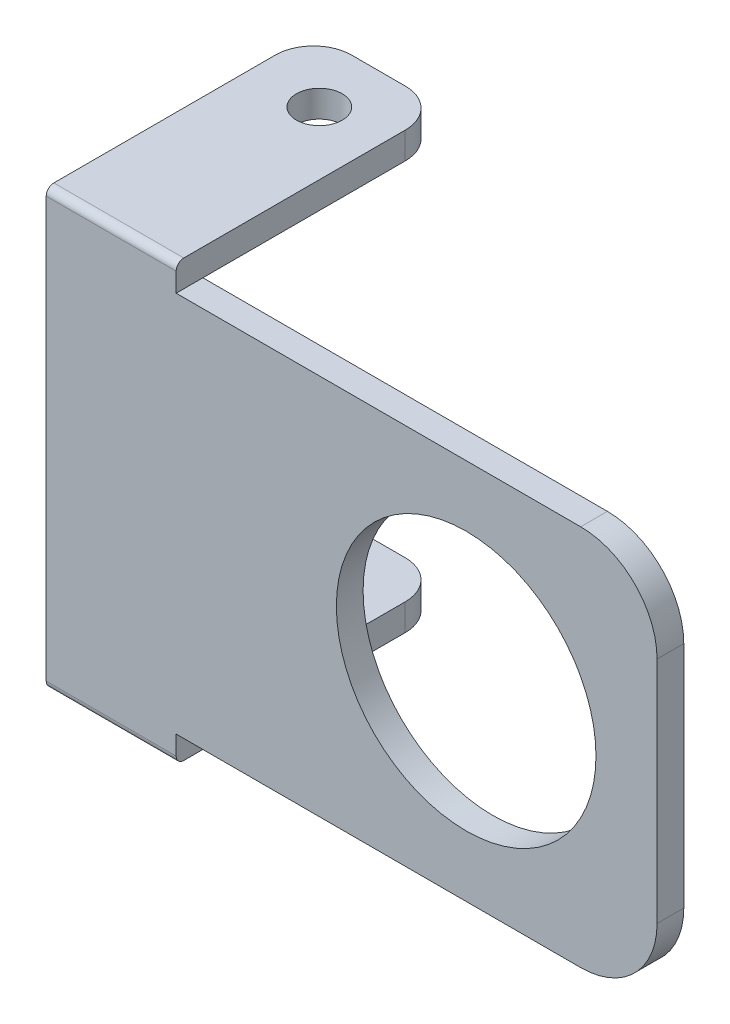
ISO-10303-21;
HEADER;
FILE_DESCRIPTION(('STEP AP214'),'2;1');
FILE_NAME('part.step','',(''),(''),'','','');
FILE_SCHEMA(('AUTOMOTIVE_DESIGN { 1 0 10303 214 1 1 1 1 }'));
ENDSEC;
DATA;
#1=APPLICATION_CONTEXT('core data for automotive mechanical design processes');
#2=APPLICATION_PROTOCOL_DEFINITION('international standard','automotive_design',2000,#1);
#3=PRODUCT_CONTEXT('',#1,'mechanical');
#4=PRODUCT('Part','Part','',(#3));
#5=PRODUCT_RELATED_PRODUCT_CATEGORY('part','',(#4));
#6=PRODUCT_DEFINITION_FORMATION('','',#4);
#7=PRODUCT_DEFINITION_CONTEXT('part definition',#1,'design');
#8=PRODUCT_DEFINITION('design','',#6,#7);
#9=PRODUCT_DEFINITION_SHAPE('','',#8);
#10=(LENGTH_UNIT() NAMED_UNIT(*) SI_UNIT(.MILLI.,.METRE.));
#11=(NAMED_UNIT(*) PLANE_ANGLE_UNIT() SI_UNIT($,.RADIAN.));
#12=(NAMED_UNIT(*) SI_UNIT($,.STERADIAN.) SOLID_ANGLE_UNIT());
#13=UNCERTAINTY_MEASURE_WITH_UNIT(LENGTH_MEASURE(1.E-05),#10,'distance_accuracy_value','');
#14=(GEOMETRIC_REPRESENTATION_CONTEXT(3) GLOBAL_UNCERTAINTY_ASSIGNED_CONTEXT((#13)) GLOBAL_UNIT_ASSIGNED_CONTEXT((#10,
#11,#12)) REPRESENTATION_CONTEXT('',''));
#15=CARTESIAN_POINT('',(0.,0.,0.));
#16=DIRECTION('',(0.,0.,1.));
#17=DIRECTION('',(1.,0.,0.));
#18=AXIS2_PLACEMENT_3D('',#15,#16,#17);
#19=CARTESIAN_POINT('',(-40.,-28.5,-31.5));
#20=DIRECTION('',(0.,1.,0.));
#21=DIRECTION('',(0.,0.,-1.));
#22=AXIS2_PLACEMENT_3D('',#19,#20,#21);
#23=PLANE('',#22);
#24=DIRECTION('',(0.,0.,1.));
#25=VECTOR('',#24,1.);
#26=CARTESIAN_POINT('',(-40.,-28.5,3.5));
#27=LINE('',#26,#25);
#28=CARTESIAN_POINT('',(-40.,-28.5,-26.5));
#29=VERTEX_POINT('',#28);
#30=CARTESIAN_POINT('',(-40.,-28.5,2.5));
#31=VERTEX_POINT('',#30);
#32=EDGE_CURVE('E199',#29,#31,#27,.T.);
#33=ORIENTED_EDGE('',*,*,#32,.F.);
#34=CARTESIAN_POINT('',(-35.,-28.5,-26.5));
#35=DIRECTION('',(0.,1.,0.));
#36=DIRECTION('',(0.,0.,1.));
#37=AXIS2_PLACEMENT_3D('',#34,#35,#36);
#38=CIRCLE('',#37,5.);
#39=CARTESIAN_POINT('',(-35.,-28.5,-31.5));
#40=VERTEX_POINT('',#39);
#41=EDGE_CURVE('E316',#29,#40,#38,.F.);
#42=ORIENTED_EDGE('',*,*,#41,.T.);
#43=DIRECTION('',(-1.,0.,0.));
#44=VECTOR('',#43,1.);
#45=CARTESIAN_POINT('',(-22.9795824028962,-28.5,-31.5));
#46=LINE('',#45,#44);
#47=CARTESIAN_POINT('',(-27.9795824028962,-28.5,-31.5));
#48=VERTEX_POINT('',#47);
#49=EDGE_CURVE('E284',#48,#40,#46,.T.);
#50=ORIENTED_EDGE('',*,*,#49,.F.);
#51=CARTESIAN_POINT('',(-27.9795824028962,-28.5,-26.5));
#52=DIRECTION('',(0.,1.,0.));
#53=DIRECTION('',(0.,0.,1.));
#54=AXIS2_PLACEMENT_3D('',#51,#52,#53);
#55=CIRCLE('',#54,5.);
#56=CARTESIAN_POINT('',(-22.9795824028962,-28.5,-26.5));
#57=VERTEX_POINT('',#56);
#58=EDGE_CURVE('E314',#48,#57,#55,.F.);
#59=ORIENTED_EDGE('',*,*,#58,.T.);
#60=DIRECTION('',(0.,0.,-1.));
#61=VECTOR('',#60,1.);
#62=CARTESIAN_POINT('',(-22.9795824028962,-28.5,3.50000000000001));
#63=LINE('',#62,#61);
#64=CARTESIAN_POINT('',(-22.9795824028962,-28.5,2.5));
#65=VERTEX_POINT('',#64);
#66=EDGE_CURVE('E542',#65,#57,#63,.T.);
#67=ORIENTED_EDGE('',*,*,#66,.F.);
#68=DIRECTION('',(1.,0.,0.));
#69=VECTOR('',#68,1.);
#70=CARTESIAN_POINT('',(-40.,-28.5,2.5));
#71=LINE('',#70,#69);
#72=EDGE_CURVE('E273',#65,#31,#71,.F.);
#73=ORIENTED_EDGE('',*,*,#72,.T.);
#74=EDGE_LOOP('',(#33,#42,#50,#59,#67,#73));
#75=FACE_BOUND('',#74,.T.);
#76=CARTESIAN_POINT('',(-31.2295824028962,-28.5,-23.5));
#77=DIRECTION('',(0.,1.,0.));
#78=DIRECTION('',(0.,0.,1.));
#79=AXIS2_PLACEMENT_3D('',#76,#77,#78);
#80=CIRCLE('',#79,3.);
#81=CARTESIAN_POINT('',(-31.2295824028962,-28.5,-20.5));
#82=VERTEX_POINT('',#81);
#83=EDGE_CURVE('E344',#82,#82,#80,.T.);
#84=ORIENTED_EDGE('',*,*,#83,.T.);
#85=EDGE_LOOP('',(#84));
#86=FACE_BOUND('',#85,.T.);
#87=ADVANCED_FACE('F32',(#75,#86),#23,.F.);
#88=CARTESIAN_POINT('',(-40.,-25.,-31.5));
#89=DIRECTION('',(0.,1.,0.));
#90=DIRECTION('',(0.,0.,-1.));
#91=AXIS2_PLACEMENT_3D('',#88,#89,#90);
#92=PLANE('',#91);
#93=DIRECTION('',(-1.,0.,0.));
#94=VECTOR('',#93,1.);
#95=CARTESIAN_POINT('',(-22.9795824028962,-25.,-31.5));
#96=LINE('',#95,#94);
#97=CARTESIAN_POINT('',(-27.9795824028962,-25.,-31.5));
#98=VERTEX_POINT('',#97);
#99=CARTESIAN_POINT('',(-35.,-25.,-31.5));
#100=VERTEX_POINT('',#99);
#101=EDGE_CURVE('E339',#98,#100,#96,.T.);
#102=ORIENTED_EDGE('',*,*,#101,.T.);
#103=CARTESIAN_POINT('',(-35.,-25.,-26.5));
#104=DIRECTION('',(0.,1.,0.));
#105=DIRECTION('',(0.,0.,1.));
#106=AXIS2_PLACEMENT_3D('',#103,#104,#105);
#107=CIRCLE('',#106,5.);
#108=CARTESIAN_POINT('',(-40.,-25.,-26.5));
#109=VERTEX_POINT('',#108);
#110=EDGE_CURVE('E308',#100,#109,#107,.T.);
#111=ORIENTED_EDGE('',*,*,#110,.T.);
#112=DIRECTION('',(0.,0.,1.));
#113=VECTOR('',#112,1.);
#114=CARTESIAN_POINT('',(-40.,-25.,3.5));
#115=LINE('',#114,#113);
#116=CARTESIAN_POINT('',(-40.,-25.,0.));
#117=VERTEX_POINT('',#116);
#118=EDGE_CURVE('E210',#109,#117,#115,.T.);
#119=ORIENTED_EDGE('',*,*,#118,.T.);
#120=DIRECTION('',(1.,0.,0.));
#121=VECTOR('',#120,1.);
#122=CARTESIAN_POINT('',(-40.,-25.,0.));
#123=LINE('',#122,#121);
#124=CARTESIAN_POINT('',(-22.9795824028962,-25.,0.));
#125=VERTEX_POINT('',#124);
#126=EDGE_CURVE('E250',#117,#125,#123,.T.);
#127=ORIENTED_EDGE('',*,*,#126,.T.);
#128=DIRECTION('',(0.,0.,-1.));
#129=VECTOR('',#128,1.);
#130=CARTESIAN_POINT('',(-22.9795824028962,-25.,3.50000000000001));
#131=LINE('',#130,#129);
#132=CARTESIAN_POINT('',(-22.9795824028962,-25.,-26.5));
#133=VERTEX_POINT('',#132);
#134=EDGE_CURVE('E207',#125,#133,#131,.T.);
#135=ORIENTED_EDGE('',*,*,#134,.T.);
#136=CARTESIAN_POINT('',(-27.9795824028962,-25.,-26.5));
#137=DIRECTION('',(0.,1.,0.));
#138=DIRECTION('',(0.,0.,1.));
#139=AXIS2_PLACEMENT_3D('',#136,#137,#138);
#140=CIRCLE('',#139,5.);
#141=EDGE_CURVE('E281',#133,#98,#140,.T.);
#142=ORIENTED_EDGE('',*,*,#141,.T.);
#143=EDGE_LOOP('',(#102,#111,#119,#127,#135,#142));
#144=FACE_BOUND('',#143,.T.);
#145=CARTESIAN_POINT('',(-31.2295824028962,-25.,-23.5));
#146=DIRECTION('',(0.,1.,0.));
#147=DIRECTION('',(0.,0.,1.));
#148=AXIS2_PLACEMENT_3D('',#145,#146,#147);
#149=CIRCLE('',#148,3.);
#150=CARTESIAN_POINT('',(-31.2295824028962,-25.,-20.5));
#151=VERTEX_POINT('',#150);
#152=EDGE_CURVE('E341',#151,#151,#149,.F.);
#153=ORIENTED_EDGE('',*,*,#152,.T.);
#154=EDGE_LOOP('',(#153));
#155=FACE_BOUND('',#154,.T.);
#156=ADVANCED_FACE('F437',(#144,#155),#92,.T.);
#157=CARTESIAN_POINT('',(-40.,25.,3.5));
#158=DIRECTION('',(0.,-1.,0.));
#159=DIRECTION('',(0.,0.,-1.));
#160=AXIS2_PLACEMENT_3D('',#157,#158,#159);
#161=PLANE('',#160);
#162=DIRECTION('',(-1.,0.,0.));
#163=VECTOR('',#162,1.);
#164=CARTESIAN_POINT('',(-40.,25.,3.5));
#165=LINE('',#164,#163);
#166=CARTESIAN_POINT('',(30.,25.,3.5));
#167=VERTEX_POINT('',#166);
#168=CARTESIAN_POINT('',(-22.9795824028962,25.,3.5));
#169=VERTEX_POINT('',#168);
#170=EDGE_CURVE('E219',#167,#169,#165,.T.);
#171=ORIENTED_EDGE('',*,*,#170,.F.);
#172=DIRECTION('',(0.,0.,-1.));
#173=VECTOR('',#172,1.);
#174=CARTESIAN_POINT('',(30.,25.,3.5));
#175=LINE('',#174,#173);
#176=CARTESIAN_POINT('',(30.,25.,0.));
#177=VERTEX_POINT('',#176);
#178=EDGE_CURVE('E335',#167,#177,#175,.T.);
#179=ORIENTED_EDGE('',*,*,#178,.T.);
#180=DIRECTION('',(-1.,0.,0.));
#181=VECTOR('',#180,1.);
#182=CARTESIAN_POINT('',(-40.,25.,0.));
#183=LINE('',#182,#181);
#184=CARTESIAN_POINT('',(-22.9795824028962,25.,0.));
#185=VERTEX_POINT('',#184);
#186=EDGE_CURVE('E234',#177,#185,#183,.T.);
#187=ORIENTED_EDGE('',*,*,#186,.T.);
#188=DIRECTION('',(0.,0.,-1.));
#189=VECTOR('',#188,1.);
#190=CARTESIAN_POINT('',(-22.9795824028962,25.,3.50000000000001));
#191=LINE('',#190,#189);
#192=EDGE_CURVE('E294',#169,#185,#191,.T.);
#193=ORIENTED_EDGE('',*,*,#192,.F.);
#194=EDGE_LOOP('',(#171,#179,#187,#193));
#195=FACE_BOUND('',#194,.T.);
#196=ADVANCED_FACE('F410',(#195),#161,.F.);
#197=CARTESIAN_POINT('',(40.,25.,3.5));
#198=DIRECTION('',(-1.,0.,0.));
#199=DIRECTION('',(0.,0.,1.));
#200=AXIS2_PLACEMENT_3D('',#197,#198,#199);
#201=PLANE('',#200);
#202=DIRECTION('',(0.,1.,0.));
#203=VECTOR('',#202,1.);
#204=CARTESIAN_POINT('',(40.,25.,0.));
#205=LINE('',#204,#203);
#206=CARTESIAN_POINT('',(40.,-15.,0.));
#207=VERTEX_POINT('',#206);
#208=CARTESIAN_POINT('',(40.,15.,0.));
#209=VERTEX_POINT('',#208);
#210=EDGE_CURVE('E230',#207,#209,#205,.T.);
#211=ORIENTED_EDGE('',*,*,#210,.T.);
#212=DIRECTION('',(0.,0.,-1.));
#213=VECTOR('',#212,1.);
#214=CARTESIAN_POINT('',(40.,15.,3.5));
#215=LINE('',#214,#213);
#216=CARTESIAN_POINT('',(40.,15.,3.5));
#217=VERTEX_POINT('',#216);
#218=EDGE_CURVE('E53',#209,#217,#215,.F.);
#219=ORIENTED_EDGE('',*,*,#218,.T.);
#220=DIRECTION('',(0.,1.,0.));
#221=VECTOR('',#220,1.);
#222=CARTESIAN_POINT('',(40.,25.,3.5));
#223=LINE('',#222,#221);
#224=CARTESIAN_POINT('',(40.,-15.,3.5));
#225=VERTEX_POINT('',#224);
#226=EDGE_CURVE('E251',#225,#217,#223,.T.);
#227=ORIENTED_EDGE('',*,*,#226,.F.);
#228=DIRECTION('',(0.,0.,-1.));
#229=VECTOR('',#228,1.);
#230=CARTESIAN_POINT('',(40.,-15.,3.5));
#231=LINE('',#230,#229);
#232=EDGE_CURVE('E416',#225,#207,#231,.T.);
#233=ORIENTED_EDGE('',*,*,#232,.T.);
#234=EDGE_LOOP('',(#211,#219,#227,#233));
#235=FACE_BOUND('',#234,.T.);
#236=ADVANCED_FACE('F491',(#235),#201,.F.);
#237=CARTESIAN_POINT('',(-40.,25.,3.5));
#238=DIRECTION('',(1.,0.,0.));
#239=DIRECTION('',(0.,0.,-1.));
#240=AXIS2_PLACEMENT_3D('',#237,#238,#239);
#241=PLANE('',#240);
#242=ORIENTED_EDGE('',*,*,#118,.F.);
#243=DIRECTION('',(0.,1.,0.));
#244=VECTOR('',#243,1.);
#245=CARTESIAN_POINT('',(-40.,-28.5,-26.5));
#246=LINE('',#245,#244);
#247=EDGE_CURVE('E312',#109,#29,#246,.F.);
#248=ORIENTED_EDGE('',*,*,#247,.T.);
#249=ORIENTED_EDGE('',*,*,#32,.T.);
#250=CARTESIAN_POINT('',(-40.,-27.5,2.5));
#251=DIRECTION('',(1.,0.,0.));
#252=DIRECTION('',(0.,0.,-1.));
#253=AXIS2_PLACEMENT_3D('',#250,#251,#252);
#254=CIRCLE('',#253,1.);
#255=CARTESIAN_POINT('',(-40.,-27.5,3.5));
#256=VERTEX_POINT('',#255);
#257=EDGE_CURVE('E266',#31,#256,#254,.F.);
#258=ORIENTED_EDGE('',*,*,#257,.T.);
#259=DIRECTION('',(0.,-1.,0.));
#260=VECTOR('',#259,1.);
#261=CARTESIAN_POINT('',(-40.,25.,3.5));
#262=LINE('',#261,#260);
#263=CARTESIAN_POINT('',(-40.,27.5,3.5));
#264=VERTEX_POINT('',#263);
#265=EDGE_CURVE('E214',#264,#256,#262,.T.);
#266=ORIENTED_EDGE('',*,*,#265,.F.);
#267=CARTESIAN_POINT('',(-40.,27.5,2.5));
#268=DIRECTION('',(1.,0.,0.));
#269=DIRECTION('',(0.,0.,-1.));
#270=AXIS2_PLACEMENT_3D('',#267,#268,#269);
#271=CIRCLE('',#270,1.);
#272=CARTESIAN_POINT('',(-40.,28.5,2.5));
#273=VERTEX_POINT('',#272);
#274=EDGE_CURVE('E268',#264,#273,#271,.F.);
#275=ORIENTED_EDGE('',*,*,#274,.T.);
#276=DIRECTION('',(0.,0.,1.));
#277=VECTOR('',#276,1.);
#278=CARTESIAN_POINT('',(-40.,28.5,3.5));
#279=LINE('',#278,#277);
#280=CARTESIAN_POINT('',(-40.,28.5,-26.5));
#281=VERTEX_POINT('',#280);
#282=EDGE_CURVE('E293',#281,#273,#279,.T.);
#283=ORIENTED_EDGE('',*,*,#282,.F.);
#284=DIRECTION('',(0.,-1.,0.));
#285=VECTOR('',#284,1.);
#286=CARTESIAN_POINT('',(-40.,25.,-26.5));
#287=LINE('',#286,#285);
#288=CARTESIAN_POINT('',(-40.,25.,-26.5));
#289=VERTEX_POINT('',#288);
#290=EDGE_CURVE('E309',#281,#289,#287,.T.);
#291=ORIENTED_EDGE('',*,*,#290,.T.);
#292=DIRECTION('',(0.,0.,1.));
#293=VECTOR('',#292,1.);
#294=CARTESIAN_POINT('',(-40.,25.,3.5));
#295=LINE('',#294,#293);
#296=CARTESIAN_POINT('',(-40.,25.,0.));
#297=VERTEX_POINT('',#296);
#298=EDGE_CURVE('E300',#289,#297,#295,.T.);
#299=ORIENTED_EDGE('',*,*,#298,.T.);
#300=DIRECTION('',(0.,-1.,0.));
#301=VECTOR('',#300,1.);
#302=CARTESIAN_POINT('',(-40.,25.,0.));
#303=LINE('',#302,#301);
#304=EDGE_CURVE('E237',#297,#117,#303,.T.);
#305=ORIENTED_EDGE('',*,*,#304,.T.);
#306=EDGE_LOOP('',(#242,#248,#249,#258,#266,#275,#283,#291,#299,#305));
#307=FACE_BOUND('',#306,.T.);
#308=ADVANCED_FACE('F488',(#307),#241,.F.);
#309=CARTESIAN_POINT('',(-40.,-25.,3.5));
#310=DIRECTION('',(0.,1.,0.));
#311=DIRECTION('',(0.,0.,1.));
#312=AXIS2_PLACEMENT_3D('',#309,#310,#311);
#313=PLANE('',#312);
#314=CARTESIAN_POINT('',(30.,-25.,0.));
#315=VERTEX_POINT('',#314);
#316=EDGE_CURVE('E238',#125,#315,#123,.T.);
#317=ORIENTED_EDGE('',*,*,#316,.T.);
#318=DIRECTION('',(0.,0.,-1.));
#319=VECTOR('',#318,1.);
#320=CARTESIAN_POINT('',(30.,-25.,3.5));
#321=LINE('',#320,#319);
#322=CARTESIAN_POINT('',(30.,-25.,3.5));
#323=VERTEX_POINT('',#322);
#324=EDGE_CURVE('E11',#315,#323,#321,.F.);
#325=ORIENTED_EDGE('',*,*,#324,.T.);
#326=DIRECTION('',(1.,0.,0.));
#327=VECTOR('',#326,1.);
#328=CARTESIAN_POINT('',(-40.,-25.,3.5));
#329=LINE('',#328,#327);
#330=CARTESIAN_POINT('',(-22.9795824028962,-25.,3.50000000000001));
#331=VERTEX_POINT('',#330);
#332=EDGE_CURVE('E192',#331,#323,#329,.T.);
#333=ORIENTED_EDGE('',*,*,#332,.F.);
#334=EDGE_CURVE('E202',#331,#125,#131,.T.);
#335=ORIENTED_EDGE('',*,*,#334,.T.);
#336=EDGE_LOOP('',(#317,#325,#333,#335));
#337=FACE_BOUND('',#336,.T.);
#338=ADVANCED_FACE('F212',(#337),#313,.F.);
#339=CARTESIAN_POINT('',(40.,-25.,3.5));
#340=DIRECTION('',(0.,0.,1.));
#341=DIRECTION('',(1.,0.,0.));
#342=AXIS2_PLACEMENT_3D('',#339,#340,#341);
#343=PLANE('',#342);
#344=CARTESIAN_POINT('',(15.,0.,3.5));
#345=DIRECTION('',(0.,0.,1.));
#346=DIRECTION('',(1.,0.,0.));
#347=AXIS2_PLACEMENT_3D('',#344,#345,#346);
#348=CIRCLE('',#347,17.);
#349=CARTESIAN_POINT('',(32.,0.,3.5));
#350=VERTEX_POINT('',#349);
#351=EDGE_CURVE('E564',#350,#350,#348,.T.);
#352=ORIENTED_EDGE('',*,*,#351,.F.);
#353=EDGE_LOOP('',(#352));
#354=FACE_BOUND('',#353,.T.);
#355=ORIENTED_EDGE('',*,*,#226,.T.);
#356=CARTESIAN_POINT('',(30.,15.,3.5));
#357=DIRECTION('',(0.,0.,1.));
#358=DIRECTION('',(1.,0.,0.));
#359=AXIS2_PLACEMENT_3D('',#356,#357,#358);
#360=CIRCLE('',#359,10.);
#361=EDGE_CURVE('E40',#217,#167,#360,.T.);
#362=ORIENTED_EDGE('',*,*,#361,.T.);
#363=ORIENTED_EDGE('',*,*,#170,.T.);
#364=DIRECTION('',(0.,-1.,0.));
#365=VECTOR('',#364,1.);
#366=CARTESIAN_POINT('',(-22.9795824028962,28.5,3.50000000000001));
#367=LINE('',#366,#365);
#368=CARTESIAN_POINT('',(-22.9795824028962,27.5,3.50000000000001));
#369=VERTEX_POINT('',#368);
#370=EDGE_CURVE('E257',#369,#169,#367,.T.);
#371=ORIENTED_EDGE('',*,*,#370,.F.);
#372=DIRECTION('',(1.,0.,0.));
#373=VECTOR('',#372,1.);
#374=CARTESIAN_POINT('',(-40.,27.5,3.5));
#375=LINE('',#374,#373);
#376=EDGE_CURVE('E264',#369,#264,#375,.F.);
#377=ORIENTED_EDGE('',*,*,#376,.T.);
#378=ORIENTED_EDGE('',*,*,#265,.T.);
#379=DIRECTION('',(1.,0.,0.));
#380=VECTOR('',#379,1.);
#381=CARTESIAN_POINT('',(-22.9795824028962,-27.5,3.5));
#382=LINE('',#381,#380);
#383=CARTESIAN_POINT('',(-22.9795824028962,-27.5,3.50000000000001));
#384=VERTEX_POINT('',#383);
#385=EDGE_CURVE('E196',#256,#384,#382,.T.);
#386=ORIENTED_EDGE('',*,*,#385,.T.);
#387=DIRECTION('',(0.,1.,0.));
#388=VECTOR('',#387,1.);
#389=CARTESIAN_POINT('',(-22.9795824028962,-28.5,3.50000000000001));
#390=LINE('',#389,#388);
#391=EDGE_CURVE('E189',#384,#331,#390,.T.);
#392=ORIENTED_EDGE('',*,*,#391,.T.);
#393=ORIENTED_EDGE('',*,*,#332,.T.);
#394=CARTESIAN_POINT('',(30.,-15.,3.5));
#395=DIRECTION('',(0.,0.,1.));
#396=DIRECTION('',(1.,0.,0.));
#397=AXIS2_PLACEMENT_3D('',#394,#395,#396);
#398=CIRCLE('',#397,10.);
#399=EDGE_CURVE('E422',#323,#225,#398,.T.);
#400=ORIENTED_EDGE('',*,*,#399,.T.);
#401=EDGE_LOOP('',(#355,#362,#363,#371,#377,#378,#386,#392,#393,#400));
#402=FACE_BOUND('',#401,.T.);
#403=ADVANCED_FACE('F191',(#354,#402),#343,.T.);
#404=CARTESIAN_POINT('',(40.,-25.,0.));
#405=DIRECTION('',(0.,0.,1.));
#406=DIRECTION('',(1.,0.,0.));
#407=AXIS2_PLACEMENT_3D('',#404,#405,#406);
#408=PLANE('',#407);
#409=CARTESIAN_POINT('',(15.,0.,0.));
#410=DIRECTION('',(0.,0.,-1.));
#411=DIRECTION('',(-1.,0.,0.));
#412=AXIS2_PLACEMENT_3D('',#409,#410,#411);
#413=CIRCLE('',#412,17.);
#414=CARTESIAN_POINT('',(-2.,0.,0.));
#415=VERTEX_POINT('',#414);
#416=EDGE_CURVE('E567',#415,#415,#413,.T.);
#417=ORIENTED_EDGE('',*,*,#416,.F.);
#418=EDGE_LOOP('',(#417));
#419=FACE_BOUND('',#418,.T.);
#420=DIRECTION('',(0.,-1.,0.));
#421=VECTOR('',#420,1.);
#422=CARTESIAN_POINT('',(-17.9795824028961,12.3999999999977,0.));
#423=LINE('',#422,#421);
#424=CARTESIAN_POINT('',(-17.9795824028961,12.3999999999977,0.));
#425=VERTEX_POINT('',#424);
#426=CARTESIAN_POINT('',(-17.9795824028961,-12.3999999999989,0.));
#427=VERTEX_POINT('',#426);
#428=EDGE_CURVE('E365',#425,#427,#423,.T.);
#429=ORIENTED_EDGE('',*,*,#428,.F.);
#430=CARTESIAN_POINT('',(-22.9795824028963,12.6000000000011,0.));
#431=DIRECTION('',(0.,0.,-1.));
#432=DIRECTION('',(-1.,0.,0.));
#433=AXIS2_PLACEMENT_3D('',#430,#431,#432);
#434=CIRCLE('',#433,5.00399840127908);
#435=CARTESIAN_POINT('',(-27.9835808041754,12.6000000000011,0.));
#436=VERTEX_POINT('',#435);
#437=EDGE_CURVE('E260',#436,#425,#434,.T.);
#438=ORIENTED_EDGE('',*,*,#437,.F.);
#439=DIRECTION('',(-0.000159936049108674,0.99999998721023,0.));
#440=VECTOR('',#439,1.);
#441=CARTESIAN_POINT('',(-27.9795824028966,-12.3999999999989,0.));
#442=LINE('',#441,#440);
#443=CARTESIAN_POINT('',(-27.9795824028966,-12.3999999999989,0.));
#444=VERTEX_POINT('',#443);
#445=EDGE_CURVE('E358',#444,#436,#442,.T.);
#446=ORIENTED_EDGE('',*,*,#445,.F.);
#447=CARTESIAN_POINT('',(-22.9795824028963,-12.3999999999989,0.));
#448=DIRECTION('',(0.,0.,-1.));
#449=DIRECTION('',(-1.,0.,0.));
#450=AXIS2_PLACEMENT_3D('',#447,#448,#449);
#451=CIRCLE('',#450,5.00000000000023);
#452=EDGE_CURVE('E362',#427,#444,#451,.T.);
#453=ORIENTED_EDGE('',*,*,#452,.F.);
#454=EDGE_LOOP('',(#429,#438,#446,#453));
#455=FACE_BOUND('',#454,.T.);
#456=ORIENTED_EDGE('',*,*,#186,.F.);
#457=CARTESIAN_POINT('',(30.,15.,0.));
#458=DIRECTION('',(0.,0.,1.));
#459=DIRECTION('',(1.,0.,0.));
#460=AXIS2_PLACEMENT_3D('',#457,#458,#459);
#461=CIRCLE('',#460,10.);
#462=EDGE_CURVE('E404',#177,#209,#461,.F.);
#463=ORIENTED_EDGE('',*,*,#462,.T.);
#464=ORIENTED_EDGE('',*,*,#210,.F.);
#465=CARTESIAN_POINT('',(30.,-15.,0.));
#466=DIRECTION('',(0.,0.,1.));
#467=DIRECTION('',(1.,0.,0.));
#468=AXIS2_PLACEMENT_3D('',#465,#466,#467);
#469=CIRCLE('',#468,10.);
#470=EDGE_CURVE('E415',#207,#315,#469,.F.);
#471=ORIENTED_EDGE('',*,*,#470,.T.);
#472=ORIENTED_EDGE('',*,*,#316,.F.);
#473=ORIENTED_EDGE('',*,*,#126,.F.);
#474=ORIENTED_EDGE('',*,*,#304,.F.);
#475=EDGE_CURVE('E232',#185,#297,#183,.T.);
#476=ORIENTED_EDGE('',*,*,#475,.F.);
#477=EDGE_LOOP('',(#456,#463,#464,#471,#472,#473,#474,#476));
#478=FACE_BOUND('',#477,.T.);
#479=ADVANCED_FACE('F396',(#419,#455,#478),#408,.F.);
#480=CARTESIAN_POINT('',(-22.9795824028963,12.6000000000011,3.));
#481=DIRECTION('',(0.,0.,-1.));
#482=DIRECTION('',(-1.,0.,0.));
#483=AXIS2_PLACEMENT_3D('',#480,#481,#482);
#484=CYLINDRICAL_SURFACE('',#483,5.00399840127908);
#485=ORIENTED_EDGE('',*,*,#437,.T.);
#486=DIRECTION('',(0.,0.,-1.));
#487=VECTOR('',#486,1.);
#488=CARTESIAN_POINT('',(-17.9795824028961,12.3999999999977,3.));
#489=LINE('',#488,#487);
#490=CARTESIAN_POINT('',(-17.9795824028961,12.3999999999977,3.));
#491=VERTEX_POINT('',#490);
#492=EDGE_CURVE('E349',#491,#425,#489,.T.);
#493=ORIENTED_EDGE('',*,*,#492,.F.);
#494=CARTESIAN_POINT('',(-22.9795824028963,12.6000000000011,3.));
#495=DIRECTION('',(0.,0.,-1.));
#496=DIRECTION('',(-1.,0.,0.));
#497=AXIS2_PLACEMENT_3D('',#494,#495,#496);
#498=CIRCLE('',#497,5.00399840127908);
#499=CARTESIAN_POINT('',(-27.9835808041754,12.6000000000011,3.));
#500=VERTEX_POINT('',#499);
#501=EDGE_CURVE('E361',#500,#491,#498,.T.);
#502=ORIENTED_EDGE('',*,*,#501,.F.);
#503=DIRECTION('',(0.,0.,-1.));
#504=VECTOR('',#503,1.);
#505=CARTESIAN_POINT('',(-27.9835808041754,12.6000000000011,3.));
#506=LINE('',#505,#504);
#507=EDGE_CURVE('E233',#500,#436,#506,.T.);
#508=ORIENTED_EDGE('',*,*,#507,.T.);
#509=EDGE_LOOP('',(#485,#493,#502,#508));
#510=FACE_BOUND('',#509,.T.);
#511=ADVANCED_FACE('F383',(#510),#484,.F.);
#512=CARTESIAN_POINT('',(-27.9795824028966,-12.3999999999989,3.));
#513=DIRECTION('',(-0.99999998721023,-0.000159936049108674,0.));
#514=DIRECTION('',(0.000159936049108674,-0.99999998721023,0.));
#515=AXIS2_PLACEMENT_3D('',#512,#513,#514);
#516=PLANE('',#515);
#517=ORIENTED_EDGE('',*,*,#445,.T.);
#518=ORIENTED_EDGE('',*,*,#507,.F.);
#519=DIRECTION('',(-0.000159936049108674,0.99999998721023,0.));
#520=VECTOR('',#519,1.);
#521=CARTESIAN_POINT('',(-27.9795824028966,-12.3999999999989,3.));
#522=LINE('',#521,#520);
#523=CARTESIAN_POINT('',(-27.9795824028966,-12.3999999999989,3.));
#524=VERTEX_POINT('',#523);
#525=EDGE_CURVE('E353',#524,#500,#522,.T.);
#526=ORIENTED_EDGE('',*,*,#525,.F.);
#527=DIRECTION('',(0.,0.,-1.));
#528=VECTOR('',#527,1.);
#529=CARTESIAN_POINT('',(-27.9795824028966,-12.3999999999989,3.));
#530=LINE('',#529,#528);
#531=EDGE_CURVE('E355',#524,#444,#530,.T.);
#532=ORIENTED_EDGE('',*,*,#531,.T.);
#533=EDGE_LOOP('',(#517,#518,#526,#532));
#534=FACE_BOUND('',#533,.T.);
#535=ADVANCED_FACE('F393',(#534),#516,.F.);
#536=CARTESIAN_POINT('',(-22.9795824028963,-12.3999999999989,3.));
#537=DIRECTION('',(0.,0.,-1.));
#538=DIRECTION('',(-1.,0.,0.));
#539=AXIS2_PLACEMENT_3D('',#536,#537,#538);
#540=CYLINDRICAL_SURFACE('',#539,5.00000000000023);
#541=ORIENTED_EDGE('',*,*,#452,.T.);
#542=ORIENTED_EDGE('',*,*,#531,.F.);
#543=CARTESIAN_POINT('',(-22.9795824028963,-12.3999999999989,3.));
#544=DIRECTION('',(0.,0.,-1.));
#545=DIRECTION('',(-1.,0.,0.));
#546=AXIS2_PLACEMENT_3D('',#543,#544,#545);
#547=CIRCLE('',#546,5.00000000000023);
#548=CARTESIAN_POINT('',(-17.9795824028961,-12.3999999999989,3.));
#549=VERTEX_POINT('',#548);
#550=EDGE_CURVE('E371',#549,#524,#547,.T.);
#551=ORIENTED_EDGE('',*,*,#550,.F.);
#552=DIRECTION('',(0.,0.,-1.));
#553=VECTOR('',#552,1.);
#554=CARTESIAN_POINT('',(-17.9795824028961,-12.3999999999989,3.));
#555=LINE('',#554,#553);
#556=EDGE_CURVE('E352',#549,#427,#555,.T.);
#557=ORIENTED_EDGE('',*,*,#556,.T.);
#558=EDGE_LOOP('',(#541,#542,#551,#557));
#559=FACE_BOUND('',#558,.T.);
#560=ADVANCED_FACE('F391',(#559),#540,.F.);
#561=CARTESIAN_POINT('',(-17.9795824028961,12.3999999999977,3.));
#562=DIRECTION('',(1.,0.,0.));
#563=DIRECTION('',(0.,0.,-1.));
#564=AXIS2_PLACEMENT_3D('',#561,#562,#563);
#565=PLANE('',#564);
#566=ORIENTED_EDGE('',*,*,#428,.T.);
#567=ORIENTED_EDGE('',*,*,#556,.F.);
#568=DIRECTION('',(0.,-1.,0.));
#569=VECTOR('',#568,1.);
#570=CARTESIAN_POINT('',(-17.9795824028961,12.3999999999977,3.));
#571=LINE('',#570,#569);
#572=EDGE_CURVE('E374',#491,#549,#571,.T.);
#573=ORIENTED_EDGE('',*,*,#572,.F.);
#574=ORIENTED_EDGE('',*,*,#492,.T.);
#575=EDGE_LOOP('',(#566,#567,#573,#574));
#576=FACE_BOUND('',#575,.T.);
#577=ADVANCED_FACE('F387',(#576),#565,.F.);
#578=CARTESIAN_POINT('',(-22.9795824028963,12.6000000000011,3.));
#579=DIRECTION('',(0.,0.,-1.));
#580=DIRECTION('',(-1.,0.,0.));
#581=AXIS2_PLACEMENT_3D('',#578,#579,#580);
#582=PLANE('',#581);
#583=ORIENTED_EDGE('',*,*,#501,.T.);
#584=ORIENTED_EDGE('',*,*,#572,.T.);
#585=ORIENTED_EDGE('',*,*,#550,.T.);
#586=ORIENTED_EDGE('',*,*,#525,.T.);
#587=EDGE_LOOP('',(#583,#584,#585,#586));
#588=FACE_BOUND('',#587,.T.);
#589=ADVANCED_FACE('F379',(#588),#582,.T.);
#590=CARTESIAN_POINT('',(-22.9795824028962,28.5,-31.5));
#591=DIRECTION('',(0.,0.,1.));
#592=DIRECTION('',(1.,0.,0.));
#593=AXIS2_PLACEMENT_3D('',#590,#591,#592);
#594=PLANE('',#593);
#595=DIRECTION('',(-1.,0.,0.));
#596=VECTOR('',#595,1.);
#597=CARTESIAN_POINT('',(-22.9795824028962,25.,-31.5));
#598=LINE('',#597,#596);
#599=CARTESIAN_POINT('',(-27.9795824028962,25.,-31.5));
#600=VERTEX_POINT('',#599);
#601=CARTESIAN_POINT('',(-35.,25.,-31.5));
#602=VERTEX_POINT('',#601);
#603=EDGE_CURVE('E198',#600,#602,#598,.T.);
#604=ORIENTED_EDGE('',*,*,#603,.T.);
#605=DIRECTION('',(0.,-1.,0.));
#606=VECTOR('',#605,1.);
#607=CARTESIAN_POINT('',(-35.,28.5,-31.5));
#608=LINE('',#607,#606);
#609=CARTESIAN_POINT('',(-35.,28.5,-31.5));
#610=VERTEX_POINT('',#609);
#611=EDGE_CURVE('E327',#602,#610,#608,.F.);
#612=ORIENTED_EDGE('',*,*,#611,.T.);
#613=DIRECTION('',(-1.,0.,0.));
#614=VECTOR('',#613,1.);
#615=CARTESIAN_POINT('',(-22.9795824028962,28.5,-31.5));
#616=LINE('',#615,#614);
#617=CARTESIAN_POINT('',(-27.9795824028962,28.5,-31.5));
#618=VERTEX_POINT('',#617);
#619=EDGE_CURVE('E290',#618,#610,#616,.T.);
#620=ORIENTED_EDGE('',*,*,#619,.F.);
#621=DIRECTION('',(0.,-1.,0.));
#622=VECTOR('',#621,1.);
#623=CARTESIAN_POINT('',(-27.9795824028962,28.5,-31.5));
#624=LINE('',#623,#622);
#625=EDGE_CURVE('E324',#618,#600,#624,.T.);
#626=ORIENTED_EDGE('',*,*,#625,.T.);
#627=EDGE_LOOP('',(#604,#612,#620,#626));
#628=FACE_BOUND('',#627,.T.);
#629=ADVANCED_FACE('F468',(#628),#594,.F.);
#630=CARTESIAN_POINT('',(-22.9795824028962,28.5,3.50000000000001));
#631=DIRECTION('',(-1.,0.,0.));
#632=DIRECTION('',(0.,0.,1.));
#633=AXIS2_PLACEMENT_3D('',#630,#631,#632);
#634=PLANE('',#633);
#635=CARTESIAN_POINT('',(-22.9795824028962,25.,-26.5));
#636=VERTEX_POINT('',#635);
#637=EDGE_CURVE('E303',#185,#636,#191,.T.);
#638=ORIENTED_EDGE('',*,*,#637,.T.);
#639=DIRECTION('',(0.,-1.,0.));
#640=VECTOR('',#639,1.);
#641=CARTESIAN_POINT('',(-22.9795824028962,28.5,-26.5));
#642=LINE('',#641,#640);
#643=CARTESIAN_POINT('',(-22.9795824028962,28.5,-26.5));
#644=VERTEX_POINT('',#643);
#645=EDGE_CURVE('E333',#636,#644,#642,.F.);
#646=ORIENTED_EDGE('',*,*,#645,.T.);
#647=DIRECTION('',(0.,0.,-1.));
#648=VECTOR('',#647,1.);
#649=CARTESIAN_POINT('',(-22.9795824028962,28.5,3.50000000000001));
#650=LINE('',#649,#648);
#651=CARTESIAN_POINT('',(-22.9795824028962,28.5,2.5));
#652=VERTEX_POINT('',#651);
#653=EDGE_CURVE('E261',#652,#644,#650,.T.);
#654=ORIENTED_EDGE('',*,*,#653,.F.);
#655=CARTESIAN_POINT('',(-22.9795824028962,27.5,2.5));
#656=DIRECTION('',(-1.,0.,0.));
#657=DIRECTION('',(0.,0.,1.));
#658=AXIS2_PLACEMENT_3D('',#655,#656,#657);
#659=CIRCLE('',#658,1.);
#660=EDGE_CURVE('E217',#652,#369,#659,.F.);
#661=ORIENTED_EDGE('',*,*,#660,.T.);
#662=ORIENTED_EDGE('',*,*,#370,.T.);
#663=ORIENTED_EDGE('',*,*,#192,.T.);
#664=EDGE_LOOP('',(#638,#646,#654,#661,#662,#663));
#665=FACE_BOUND('',#664,.T.);
#666=ADVANCED_FACE('F461',(#665),#634,.F.);
#667=CARTESIAN_POINT('',(-40.,28.5,-31.5));
#668=DIRECTION('',(0.,-1.,0.));
#669=DIRECTION('',(0.,0.,-1.));
#670=AXIS2_PLACEMENT_3D('',#667,#668,#669);
#671=PLANE('',#670);
#672=CARTESIAN_POINT('',(-31.2295824028962,28.5,-23.5));
#673=DIRECTION('',(0.,1.,0.));
#674=DIRECTION('',(0.,0.,1.));
#675=AXIS2_PLACEMENT_3D('',#672,#673,#674);
#676=CIRCLE('',#675,3.);
#677=CARTESIAN_POINT('',(-31.2295824028962,28.5,-20.5));
#678=VERTEX_POINT('',#677);
#679=EDGE_CURVE('E340',#678,#678,#676,.T.);
#680=ORIENTED_EDGE('',*,*,#679,.F.);
#681=EDGE_LOOP('',(#680));
#682=FACE_BOUND('',#681,.T.);
#683=ORIENTED_EDGE('',*,*,#619,.T.);
#684=CARTESIAN_POINT('',(-35.,28.5,-26.5));
#685=DIRECTION('',(0.,-1.,0.));
#686=DIRECTION('',(0.,0.,-1.));
#687=AXIS2_PLACEMENT_3D('',#684,#685,#686);
#688=CIRCLE('',#687,5.);
#689=EDGE_CURVE('E331',#610,#281,#688,.F.);
#690=ORIENTED_EDGE('',*,*,#689,.T.);
#691=ORIENTED_EDGE('',*,*,#282,.T.);
#692=DIRECTION('',(1.,0.,0.));
#693=VECTOR('',#692,1.);
#694=CARTESIAN_POINT('',(-22.9795824028962,28.5,2.5));
#695=LINE('',#694,#693);
#696=EDGE_CURVE('E213',#273,#652,#695,.T.);
#697=ORIENTED_EDGE('',*,*,#696,.T.);
#698=ORIENTED_EDGE('',*,*,#653,.T.);
#699=CARTESIAN_POINT('',(-27.9795824028962,28.5,-26.5));
#700=DIRECTION('',(0.,-1.,0.));
#701=DIRECTION('',(0.,0.,-1.));
#702=AXIS2_PLACEMENT_3D('',#699,#700,#701);
#703=CIRCLE('',#702,5.);
#704=EDGE_CURVE('E329',#644,#618,#703,.F.);
#705=ORIENTED_EDGE('',*,*,#704,.T.);
#706=EDGE_LOOP('',(#683,#690,#691,#697,#698,#705));
#707=FACE_BOUND('',#706,.T.);
#708=ADVANCED_FACE('F458',(#682,#707),#671,.F.);
#709=CARTESIAN_POINT('',(-40.,25.,-31.5));
#710=DIRECTION('',(0.,-1.,0.));
#711=DIRECTION('',(0.,0.,-1.));
#712=AXIS2_PLACEMENT_3D('',#709,#710,#711);
#713=PLANE('',#712);
#714=CARTESIAN_POINT('',(-31.2295824028962,25.,-23.5));
#715=DIRECTION('',(0.,-1.,0.));
#716=DIRECTION('',(0.,0.,-1.));
#717=AXIS2_PLACEMENT_3D('',#714,#715,#716);
#718=CIRCLE('',#717,3.);
#719=CARTESIAN_POINT('',(-31.2295824028962,25.,-26.5));
#720=VERTEX_POINT('',#719);
#721=EDGE_CURVE('E336',#720,#720,#718,.T.);
#722=ORIENTED_EDGE('',*,*,#721,.F.);
#723=EDGE_LOOP('',(#722));
#724=FACE_BOUND('',#723,.T.);
#725=ORIENTED_EDGE('',*,*,#298,.F.);
#726=CARTESIAN_POINT('',(-35.,25.,-26.5));
#727=DIRECTION('',(0.,-1.,0.));
#728=DIRECTION('',(0.,0.,-1.));
#729=AXIS2_PLACEMENT_3D('',#726,#727,#728);
#730=CIRCLE('',#729,5.);
#731=EDGE_CURVE('E322',#289,#602,#730,.T.);
#732=ORIENTED_EDGE('',*,*,#731,.T.);
#733=ORIENTED_EDGE('',*,*,#603,.F.);
#734=CARTESIAN_POINT('',(-27.9795824028962,25.,-26.5));
#735=DIRECTION('',(0.,-1.,0.));
#736=DIRECTION('',(0.,0.,-1.));
#737=AXIS2_PLACEMENT_3D('',#734,#735,#736);
#738=CIRCLE('',#737,5.);
#739=EDGE_CURVE('E320',#600,#636,#738,.T.);
#740=ORIENTED_EDGE('',*,*,#739,.T.);
#741=ORIENTED_EDGE('',*,*,#637,.F.);
#742=ORIENTED_EDGE('',*,*,#475,.T.);
#743=EDGE_LOOP('',(#725,#732,#733,#740,#741,#742));
#744=FACE_BOUND('',#743,.T.);
#745=ADVANCED_FACE('F456',(#724,#744),#713,.T.);
#746=CARTESIAN_POINT('',(-22.9795824028962,-28.5,-31.5));
#747=DIRECTION('',(0.,0.,-1.));
#748=DIRECTION('',(-1.,0.,0.));
#749=AXIS2_PLACEMENT_3D('',#746,#747,#748);
#750=PLANE('',#749);
#751=ORIENTED_EDGE('',*,*,#49,.T.);
#752=DIRECTION('',(0.,1.,0.));
#753=VECTOR('',#752,1.);
#754=CARTESIAN_POINT('',(-35.,-25.,-31.5));
#755=LINE('',#754,#753);
#756=EDGE_CURVE('E278',#40,#100,#755,.T.);
#757=ORIENTED_EDGE('',*,*,#756,.T.);
#758=ORIENTED_EDGE('',*,*,#101,.F.);
#759=DIRECTION('',(0.,1.,0.));
#760=VECTOR('',#759,1.);
#761=CARTESIAN_POINT('',(-27.9795824028962,-28.5,-31.5));
#762=LINE('',#761,#760);
#763=EDGE_CURVE('E276',#98,#48,#762,.F.);
#764=ORIENTED_EDGE('',*,*,#763,.T.);
#765=EDGE_LOOP('',(#751,#757,#758,#764));
#766=FACE_BOUND('',#765,.T.);
#767=ADVANCED_FACE('F453',(#766),#750,.T.);
#768=CARTESIAN_POINT('',(-22.9795824028962,-28.5,3.50000000000001));
#769=DIRECTION('',(1.,0.,0.));
#770=DIRECTION('',(0.,0.,-1.));
#771=AXIS2_PLACEMENT_3D('',#768,#769,#770);
#772=PLANE('',#771);
#773=ORIENTED_EDGE('',*,*,#66,.T.);
#774=DIRECTION('',(0.,1.,0.));
#775=VECTOR('',#774,1.);
#776=CARTESIAN_POINT('',(-22.9795824028962,-28.5,-26.5));
#777=LINE('',#776,#775);
#778=EDGE_CURVE('E318',#57,#133,#777,.T.);
#779=ORIENTED_EDGE('',*,*,#778,.T.);
#780=ORIENTED_EDGE('',*,*,#134,.F.);
#781=ORIENTED_EDGE('',*,*,#334,.F.);
#782=ORIENTED_EDGE('',*,*,#391,.F.);
#783=CARTESIAN_POINT('',(-22.9795824028962,-27.5,2.5));
#784=DIRECTION('',(1.,0.,0.));
#785=DIRECTION('',(0.,0.,-1.));
#786=AXIS2_PLACEMENT_3D('',#783,#784,#785);
#787=CIRCLE('',#786,1.);
#788=EDGE_CURVE('E271',#384,#65,#787,.T.);
#789=ORIENTED_EDGE('',*,*,#788,.T.);
#790=EDGE_LOOP('',(#773,#779,#780,#781,#782,#789));
#791=FACE_BOUND('',#790,.T.);
#792=ADVANCED_FACE('F204',(#791),#772,.T.);
#793=CARTESIAN_POINT('',(-40.,27.5,2.5));
#794=DIRECTION('',(-1.,0.,0.));
#795=DIRECTION('',(0.,0.,1.));
#796=AXIS2_PLACEMENT_3D('',#793,#794,#795);
#797=CYLINDRICAL_SURFACE('',#796,1.);
#798=ORIENTED_EDGE('',*,*,#274,.F.);
#799=ORIENTED_EDGE('',*,*,#376,.F.);
#800=ORIENTED_EDGE('',*,*,#660,.F.);
#801=ORIENTED_EDGE('',*,*,#696,.F.);
#802=EDGE_LOOP('',(#798,#799,#800,#801));
#803=FACE_BOUND('',#802,.T.);
#804=ADVANCED_FACE('F452',(#803),#797,.T.);
#805=CARTESIAN_POINT('',(40.,-27.5,2.5));
#806=DIRECTION('',(-1.,0.,0.));
#807=DIRECTION('',(0.,0.,1.));
#808=AXIS2_PLACEMENT_3D('',#805,#806,#807);
#809=CYLINDRICAL_SURFACE('',#808,1.);
#810=ORIENTED_EDGE('',*,*,#257,.F.);
#811=ORIENTED_EDGE('',*,*,#72,.F.);
#812=ORIENTED_EDGE('',*,*,#788,.F.);
#813=ORIENTED_EDGE('',*,*,#385,.F.);
#814=EDGE_LOOP('',(#810,#811,#812,#813));
#815=FACE_BOUND('',#814,.T.);
#816=ADVANCED_FACE('F498',(#815),#809,.T.);
#817=CARTESIAN_POINT('',(-35.,-28.5,-26.5));
#818=DIRECTION('',(0.,-1.,0.));
#819=DIRECTION('',(0.,0.,-1.));
#820=AXIS2_PLACEMENT_3D('',#817,#818,#819);
#821=CYLINDRICAL_SURFACE('',#820,5.);
#822=ORIENTED_EDGE('',*,*,#41,.F.);
#823=ORIENTED_EDGE('',*,*,#247,.F.);
#824=ORIENTED_EDGE('',*,*,#110,.F.);
#825=ORIENTED_EDGE('',*,*,#756,.F.);
#826=EDGE_LOOP('',(#822,#823,#824,#825));
#827=FACE_BOUND('',#826,.T.);
#828=ADVANCED_FACE('F502',(#827),#821,.T.);
#829=CARTESIAN_POINT('',(-27.9795824028962,-28.5,-26.5));
#830=DIRECTION('',(0.,1.,0.));
#831=DIRECTION('',(0.,0.,1.));
#832=AXIS2_PLACEMENT_3D('',#829,#830,#831);
#833=CYLINDRICAL_SURFACE('',#832,5.);
#834=ORIENTED_EDGE('',*,*,#58,.F.);
#835=ORIENTED_EDGE('',*,*,#763,.F.);
#836=ORIENTED_EDGE('',*,*,#141,.F.);
#837=ORIENTED_EDGE('',*,*,#778,.F.);
#838=EDGE_LOOP('',(#834,#835,#836,#837));
#839=FACE_BOUND('',#838,.T.);
#840=ADVANCED_FACE('F506',(#839),#833,.T.);
#841=CARTESIAN_POINT('',(-35.,25.,-26.5));
#842=DIRECTION('',(0.,-1.,0.));
#843=DIRECTION('',(0.,0.,-1.));
#844=AXIS2_PLACEMENT_3D('',#841,#842,#843);
#845=CYLINDRICAL_SURFACE('',#844,5.);
#846=ORIENTED_EDGE('',*,*,#689,.F.);
#847=ORIENTED_EDGE('',*,*,#611,.F.);
#848=ORIENTED_EDGE('',*,*,#731,.F.);
#849=ORIENTED_EDGE('',*,*,#290,.F.);
#850=EDGE_LOOP('',(#846,#847,#848,#849));
#851=FACE_BOUND('',#850,.T.);
#852=ADVANCED_FACE('F510',(#851),#845,.T.);
#853=CARTESIAN_POINT('',(-27.9795824028962,28.5,-26.5));
#854=DIRECTION('',(0.,-1.,0.));
#855=DIRECTION('',(0.,0.,-1.));
#856=AXIS2_PLACEMENT_3D('',#853,#854,#855);
#857=CYLINDRICAL_SURFACE('',#856,5.);
#858=ORIENTED_EDGE('',*,*,#704,.F.);
#859=ORIENTED_EDGE('',*,*,#645,.F.);
#860=ORIENTED_EDGE('',*,*,#739,.F.);
#861=ORIENTED_EDGE('',*,*,#625,.F.);
#862=EDGE_LOOP('',(#858,#859,#860,#861));
#863=FACE_BOUND('',#862,.T.);
#864=ADVANCED_FACE('F513',(#863),#857,.T.);
#865=CARTESIAN_POINT('',(-31.2295824028962,18.5,-23.5));
#866=DIRECTION('',(0.,1.,0.));
#867=DIRECTION('',(0.,0.,1.));
#868=AXIS2_PLACEMENT_3D('',#865,#866,#867);
#869=CYLINDRICAL_SURFACE('',#868,3.);
#870=ORIENTED_EDGE('',*,*,#721,.T.);
#871=EDGE_LOOP('',(#870));
#872=FACE_BOUND('',#871,.T.);
#873=ORIENTED_EDGE('',*,*,#679,.T.);
#874=EDGE_LOOP('',(#873));
#875=FACE_BOUND('',#874,.T.);
#876=ADVANCED_FACE('F447',(#872,#875),#869,.F.);
#877=CARTESIAN_POINT('',(-31.2295824028962,-18.5,-23.5));
#878=DIRECTION('',(0.,-1.,0.));
#879=DIRECTION('',(0.,0.,-1.));
#880=AXIS2_PLACEMENT_3D('',#877,#878,#879);
#881=CYLINDRICAL_SURFACE('',#880,3.);
#882=ORIENTED_EDGE('',*,*,#152,.F.);
#883=EDGE_LOOP('',(#882));
#884=FACE_BOUND('',#883,.T.);
#885=ORIENTED_EDGE('',*,*,#83,.F.);
#886=EDGE_LOOP('',(#885));
#887=FACE_BOUND('',#886,.T.);
#888=ADVANCED_FACE('F432',(#884,#887),#881,.F.);
#889=CARTESIAN_POINT('',(15.,0.,8.));
#890=DIRECTION('',(0.,0.,-1.));
#891=DIRECTION('',(-1.,0.,0.));
#892=AXIS2_PLACEMENT_3D('',#889,#890,#891);
#893=CYLINDRICAL_SURFACE('',#892,17.);
#894=ORIENTED_EDGE('',*,*,#351,.T.);
#895=EDGE_LOOP('',(#894));
#896=FACE_BOUND('',#895,.T.);
#897=ORIENTED_EDGE('',*,*,#416,.T.);
#898=EDGE_LOOP('',(#897));
#899=FACE_BOUND('',#898,.T.);
#900=ADVANCED_FACE('F426',(#896,#899),#893,.F.);
#901=CARTESIAN_POINT('',(30.,15.,3.5));
#902=DIRECTION('',(0.,0.,-1.));
#903=DIRECTION('',(-1.,0.,0.));
#904=AXIS2_PLACEMENT_3D('',#901,#902,#903);
#905=CYLINDRICAL_SURFACE('',#904,10.);
#906=ORIENTED_EDGE('',*,*,#361,.F.);
#907=ORIENTED_EDGE('',*,*,#218,.F.);
#908=ORIENTED_EDGE('',*,*,#462,.F.);
#909=ORIENTED_EDGE('',*,*,#178,.F.);
#910=EDGE_LOOP('',(#906,#907,#908,#909));
#911=FACE_BOUND('',#910,.T.);
#912=ADVANCED_FACE('F424',(#911),#905,.T.);
#913=CARTESIAN_POINT('',(30.,-15.,3.5));
#914=DIRECTION('',(0.,0.,-1.));
#915=DIRECTION('',(-1.,0.,0.));
#916=AXIS2_PLACEMENT_3D('',#913,#914,#915);
#917=CYLINDRICAL_SURFACE('',#916,10.);
#918=ORIENTED_EDGE('',*,*,#399,.F.);
#919=ORIENTED_EDGE('',*,*,#324,.F.);
#920=ORIENTED_EDGE('',*,*,#470,.F.);
#921=ORIENTED_EDGE('',*,*,#232,.F.);
#922=EDGE_LOOP('',(#918,#919,#920,#921));
#923=FACE_BOUND('',#922,.T.);
#924=ADVANCED_FACE('F34',(#923),#917,.T.);
#925=CLOSED_SHELL('',(#87,#156,#196,#236,#308,#338,#403,#479,#511,#535,#560,#577,#589,#629,#666,
#708,#745,#767,#792,#804,#816,#828,#840,#852,#864,#876,#888,#900,#912,#924));
#926=MANIFOLD_SOLID_BREP('B2',#925);
#927=ADVANCED_BREP_SHAPE_REPRESENTATION('',(#18,#926),#14);
#928=SHAPE_DEFINITION_REPRESENTATION(#9,#927);
ENDSEC;
END-ISO-10303-21;
